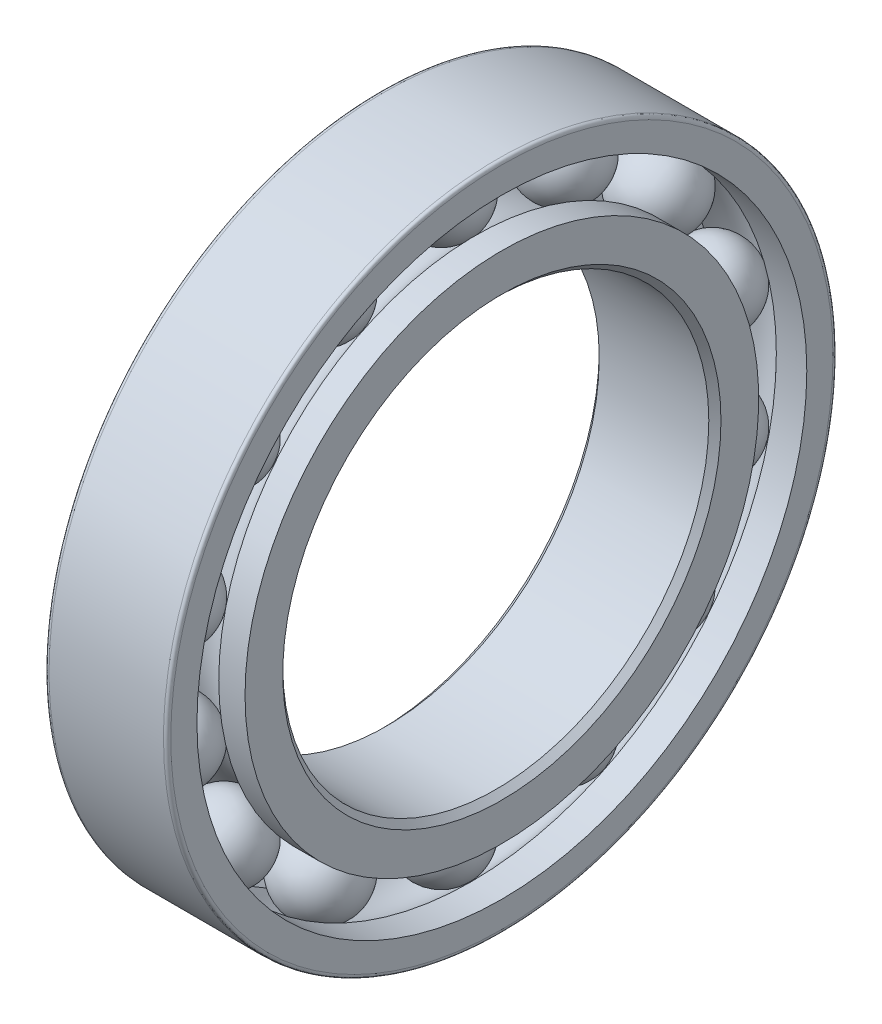
ISO-10303-21;
HEADER;
FILE_DESCRIPTION(('STEP AP214'),'2;1');
FILE_NAME('part.step','',(''),(''),'','','');
FILE_SCHEMA(('AUTOMOTIVE_DESIGN { 1 0 10303 214 1 1 1 1 }'));
ENDSEC;
DATA;
#1=APPLICATION_CONTEXT('core data for automotive mechanical design processes');
#2=APPLICATION_PROTOCOL_DEFINITION('international standard','automotive_design',2000,#1);
#3=PRODUCT_CONTEXT('',#1,'mechanical');
#4=PRODUCT('Part','Part','',(#3));
#5=PRODUCT_RELATED_PRODUCT_CATEGORY('part','',(#4));
#6=PRODUCT_DEFINITION_FORMATION('','',#4);
#7=PRODUCT_DEFINITION_CONTEXT('part definition',#1,'design');
#8=PRODUCT_DEFINITION('design','',#6,#7);
#9=PRODUCT_DEFINITION_SHAPE('','',#8);
#10=(LENGTH_UNIT() NAMED_UNIT(*) SI_UNIT(.MILLI.,.METRE.));
#11=(NAMED_UNIT(*) PLANE_ANGLE_UNIT() SI_UNIT($,.RADIAN.));
#12=(NAMED_UNIT(*) SI_UNIT($,.STERADIAN.) SOLID_ANGLE_UNIT());
#13=UNCERTAINTY_MEASURE_WITH_UNIT(LENGTH_MEASURE(1.E-05),#10,'distance_accuracy_value','');
#14=(GEOMETRIC_REPRESENTATION_CONTEXT(3) GLOBAL_UNCERTAINTY_ASSIGNED_CONTEXT((#13)) GLOBAL_UNIT_ASSIGNED_CONTEXT((#10,
#11,#12)) REPRESENTATION_CONTEXT('',''));
#15=CARTESIAN_POINT('',(0.,0.,0.));
#16=DIRECTION('',(0.,0.,1.));
#17=DIRECTION('',(1.,0.,0.));
#18=AXIS2_PLACEMENT_3D('',#15,#16,#17);
#19=CARTESIAN_POINT('',(0.,20.5781289428914,9.90990460144476));
#20=DIRECTION('',(-1.,0.,0.));
#21=DIRECTION('',(0.,0.900968867902425,0.433883739117546));
#22=AXIS2_PLACEMENT_3D('',#19,#20,#21);
#23=SPHERICAL_SURFACE('',#22,3.3);
#24=CARTESIAN_POINT('',(-3.3,20.5781289428914,9.90990460144476));
#25=VERTEX_POINT('',#24);
#26=VERTEX_LOOP('',#25);
#27=FACE_BOUND('',#26,.T.);
#28=ADVANCED_FACE('F40',(#27),#23,.T.);
#29=CLOSED_SHELL('',(#28));
#30=MANIFOLD_SOLID_BREP('B2',#29);
#31=CARTESIAN_POINT('',(0.,14.2405070744537,17.8570310595696));
#32=DIRECTION('',(-1.,0.,0.));
#33=DIRECTION('',(0.,0.623489801858743,0.781831482468022));
#34=AXIS2_PLACEMENT_3D('',#31,#32,#33);
#35=SPHERICAL_SURFACE('',#34,3.3);
#36=CARTESIAN_POINT('',(-3.3,14.2405070744537,17.8570310595696));
#37=VERTEX_POINT('',#36);
#38=VERTEX_LOOP('',#37);
#39=FACE_BOUND('',#38,.T.);
#40=ADVANCED_FACE('F59',(#39),#35,.T.);
#41=CLOSED_SHELL('',(#40));
#42=MANIFOLD_SOLID_BREP('B6',#41);
#43=CARTESIAN_POINT('',(0.,5.08237813156245,22.2673535142328));
#44=DIRECTION('',(-1.,0.,0.));
#45=DIRECTION('',(0.,0.222520933956325,0.974927912181821));
#46=AXIS2_PLACEMENT_3D('',#43,#44,#45);
#47=SPHERICAL_SURFACE('',#46,3.3);
#48=CARTESIAN_POINT('',(-3.3,5.08237813156245,22.2673535142328));
#49=VERTEX_POINT('',#48);
#50=VERTEX_LOOP('',#49);
#51=FACE_BOUND('',#50,.T.);
#52=ADVANCED_FACE('F78',(#51),#47,.T.);
#53=CLOSED_SHELL('',(#52));
#54=MANIFOLD_SOLID_BREP('B36',#53);
#55=CARTESIAN_POINT('',(0.,-5.08237813156201,22.2673535142329));
#56=DIRECTION('',(-1.,0.,0.));
#57=DIRECTION('',(0.,-0.222520933956305,0.974927912181826));
#58=AXIS2_PLACEMENT_3D('',#55,#56,#57);
#59=SPHERICAL_SURFACE('',#58,3.3);
#60=CARTESIAN_POINT('',(-3.3,-5.08237813156201,22.2673535142329));
#61=VERTEX_POINT('',#60);
#62=VERTEX_LOOP('',#61);
#63=FACE_BOUND('',#62,.T.);
#64=ADVANCED_FACE('F97',(#63),#59,.T.);
#65=CLOSED_SHELL('',(#64));
#66=MANIFOLD_SOLID_BREP('B55',#65);
#67=CARTESIAN_POINT('',(0.,-14.2405070744533,17.8570310595699));
#68=DIRECTION('',(-1.,0.,0.));
#69=DIRECTION('',(0.,-0.623489801858727,0.781831482468035));
#70=AXIS2_PLACEMENT_3D('',#67,#68,#69);
#71=SPHERICAL_SURFACE('',#70,3.3);
#72=CARTESIAN_POINT('',(-3.3,-14.2405070744533,17.8570310595699));
#73=VERTEX_POINT('',#72);
#74=VERTEX_LOOP('',#73);
#75=FACE_BOUND('',#74,.T.);
#76=ADVANCED_FACE('F116',(#75),#71,.T.);
#77=CLOSED_SHELL('',(#76));
#78=MANIFOLD_SOLID_BREP('B74',#77);
#79=CARTESIAN_POINT('',(0.,-20.5781289428912,9.90990460144519));
#80=DIRECTION('',(-1.,0.,0.));
#81=DIRECTION('',(0.,-0.900968867902416,0.433883739117565));
#82=AXIS2_PLACEMENT_3D('',#79,#80,#81);
#83=SPHERICAL_SURFACE('',#82,3.3);
#84=CARTESIAN_POINT('',(-3.3,-20.5781289428912,9.90990460144519));
#85=VERTEX_POINT('',#84);
#86=VERTEX_LOOP('',#85);
#87=FACE_BOUND('',#86,.T.);
#88=ADVANCED_FACE('F135',(#87),#83,.T.);
#89=CLOSED_SHELL('',(#88));
#90=MANIFOLD_SOLID_BREP('B93',#89);
#91=CARTESIAN_POINT('',(0.,-22.84,0.));
#92=DIRECTION('',(-1.,0.,0.));
#93=DIRECTION('',(0.,-1.,0.));
#94=AXIS2_PLACEMENT_3D('',#91,#92,#93);
#95=SPHERICAL_SURFACE('',#94,3.3);
#96=CARTESIAN_POINT('',(-3.3,-22.84,0.));
#97=VERTEX_POINT('',#96);
#98=VERTEX_LOOP('',#97);
#99=FACE_BOUND('',#98,.T.);
#100=ADVANCED_FACE('F154',(#99),#95,.T.);
#101=CLOSED_SHELL('',(#100));
#102=MANIFOLD_SOLID_BREP('B112',#101);
#103=CARTESIAN_POINT('',(0.,-20.5781289428913,-9.9099046014449));
#104=DIRECTION('',(-1.,0.,0.));
#105=DIRECTION('',(0.,-0.900968867902422,-0.433883739117553));
#106=AXIS2_PLACEMENT_3D('',#103,#104,#105);
#107=SPHERICAL_SURFACE('',#106,3.3);
#108=CARTESIAN_POINT('',(-3.3,-20.5781289428913,-9.9099046014449));
#109=VERTEX_POINT('',#108);
#110=VERTEX_LOOP('',#109);
#111=FACE_BOUND('',#110,.T.);
#112=ADVANCED_FACE('F173',(#111),#107,.T.);
#113=CLOSED_SHELL('',(#112));
#114=MANIFOLD_SOLID_BREP('B131',#113);
#115=CARTESIAN_POINT('',(0.,-14.2405070744536,-17.8570310595697));
#116=DIRECTION('',(-1.,0.,0.));
#117=DIRECTION('',(0.,-0.623489801858737,-0.781831482468027));
#118=AXIS2_PLACEMENT_3D('',#115,#116,#117);
#119=SPHERICAL_SURFACE('',#118,3.3);
#120=CARTESIAN_POINT('',(-3.3,-14.2405070744536,-17.8570310595697));
#121=VERTEX_POINT('',#120);
#122=VERTEX_LOOP('',#121);
#123=FACE_BOUND('',#122,.T.);
#124=ADVANCED_FACE('F192',(#123),#119,.T.);
#125=CLOSED_SHELL('',(#124));
#126=MANIFOLD_SOLID_BREP('B150',#125);
#127=CARTESIAN_POINT('',(0.,-5.08237813156231,-22.2673535142328));
#128=DIRECTION('',(-1.,0.,0.));
#129=DIRECTION('',(0.,-0.222520933956318,-0.974927912181823));
#130=AXIS2_PLACEMENT_3D('',#127,#128,#129);
#131=SPHERICAL_SURFACE('',#130,3.3);
#132=CARTESIAN_POINT('',(-3.3,-5.08237813156231,-22.2673535142328));
#133=VERTEX_POINT('',#132);
#134=VERTEX_LOOP('',#133);
#135=FACE_BOUND('',#134,.T.);
#136=ADVANCED_FACE('F211',(#135),#131,.T.);
#137=CLOSED_SHELL('',(#136));
#138=MANIFOLD_SOLID_BREP('B169',#137);
#139=CARTESIAN_POINT('',(0.,5.08237813156215,-22.2673535142329));
#140=DIRECTION('',(-1.,0.,0.));
#141=DIRECTION('',(0.,0.222520933956311,-0.974927912181824));
#142=AXIS2_PLACEMENT_3D('',#139,#140,#141);
#143=SPHERICAL_SURFACE('',#142,3.3);
#144=CARTESIAN_POINT('',(-3.3,5.08237813156215,-22.2673535142329));
#145=VERTEX_POINT('',#144);
#146=VERTEX_LOOP('',#145);
#147=FACE_BOUND('',#146,.T.);
#148=ADVANCED_FACE('F230',(#147),#143,.T.);
#149=CLOSED_SHELL('',(#148));
#150=MANIFOLD_SOLID_BREP('B188',#149);
#151=CARTESIAN_POINT('',(0.,14.2405070744534,-17.8570310595698));
#152=DIRECTION('',(-1.,0.,0.));
#153=DIRECTION('',(0.,0.623489801858732,-0.781831482468031));
#154=AXIS2_PLACEMENT_3D('',#151,#152,#153);
#155=SPHERICAL_SURFACE('',#154,3.3);
#156=CARTESIAN_POINT('',(-3.3,14.2405070744534,-17.8570310595698));
#157=VERTEX_POINT('',#156);
#158=VERTEX_LOOP('',#157);
#159=FACE_BOUND('',#158,.T.);
#160=ADVANCED_FACE('F249',(#159),#155,.T.);
#161=CLOSED_SHELL('',(#160));
#162=MANIFOLD_SOLID_BREP('B207',#161);
#163=CARTESIAN_POINT('',(0.,20.5781289428912,-9.90990460144505));
#164=DIRECTION('',(-1.,0.,0.));
#165=DIRECTION('',(0.,0.900968867902419,-0.433883739117559));
#166=AXIS2_PLACEMENT_3D('',#163,#164,#165);
#167=SPHERICAL_SURFACE('',#166,3.3);
#168=CARTESIAN_POINT('',(-3.3,20.5781289428912,-9.90990460144505));
#169=VERTEX_POINT('',#168);
#170=VERTEX_LOOP('',#169);
#171=FACE_BOUND('',#170,.T.);
#172=ADVANCED_FACE('F268',(#171),#167,.T.);
#173=CLOSED_SHELL('',(#172));
#174=MANIFOLD_SOLID_BREP('B226',#173);
#175=CARTESIAN_POINT('',(0.,22.84,0.));
#176=DIRECTION('',(-1.,0.,0.));
#177=DIRECTION('',(0.,1.,0.));
#178=AXIS2_PLACEMENT_3D('',#175,#176,#177);
#179=SPHERICAL_SURFACE('',#178,3.3);
#180=CARTESIAN_POINT('',(-3.3,22.84,0.));
#181=VERTEX_POINT('',#180);
#182=VERTEX_LOOP('',#181);
#183=FACE_BOUND('',#182,.T.);
#184=ADVANCED_FACE('F289',(#183),#179,.T.);
#185=CLOSED_SHELL('',(#184));
#186=MANIFOLD_SOLID_BREP('B245',#185);
#187=CARTESIAN_POINT('',(0.,0.,0.));
#188=DIRECTION('',(-1.,0.,0.));
#189=DIRECTION('',(0.,0.,1.));
#190=AXIS2_PLACEMENT_3D('',#187,#188,#189);
#191=TOROIDAL_SURFACE('',#190,22.8429213824207,3.33349012996014);
#192=CARTESIAN_POINT('',(-2.49819143028827,0.,0.));
#193=DIRECTION('',(-1.,0.,0.));
#194=DIRECTION('',(0.,0.,1.));
#195=AXIS2_PLACEMENT_3D('',#192,#193,#194);
#196=CIRCLE('',#195,25.05);
#197=CARTESIAN_POINT('',(-2.49819143028827,0.,25.05));
#198=VERTEX_POINT('',#197);
#199=EDGE_CURVE('E453',#198,#198,#196,.T.);
#200=ORIENTED_EDGE('',*,*,#199,.T.);
#201=EDGE_LOOP('',(#200));
#202=FACE_BOUND('',#201,.T.);
#203=CARTESIAN_POINT('',(2.49819143028827,0.,0.));
#204=DIRECTION('',(-1.,0.,0.));
#205=DIRECTION('',(0.,0.,1.));
#206=AXIS2_PLACEMENT_3D('',#203,#204,#205);
#207=CIRCLE('',#206,25.05);
#208=CARTESIAN_POINT('',(2.49819143028827,0.,25.05));
#209=VERTEX_POINT('',#208);
#210=EDGE_CURVE('E337',#209,#209,#207,.T.);
#211=ORIENTED_EDGE('',*,*,#210,.F.);
#212=EDGE_LOOP('',(#211));
#213=FACE_BOUND('',#212,.T.);
#214=ADVANCED_FACE('F309',(#202,#213),#191,.F.);
#215=CARTESIAN_POINT('',(-23.9937106918239,0.,0.));
#216=DIRECTION('',(-1.,0.,0.));
#217=DIRECTION('',(0.,0.,1.));
#218=AXIS2_PLACEMENT_3D('',#215,#216,#217);
#219=CYLINDRICAL_SURFACE('',#218,25.05);
#220=ORIENTED_EDGE('',*,*,#210,.T.);
#221=EDGE_LOOP('',(#220));
#222=FACE_BOUND('',#221,.T.);
#223=CARTESIAN_POINT('',(5.,0.,0.));
#224=DIRECTION('',(-1.,0.,0.));
#225=DIRECTION('',(0.,0.,1.));
#226=AXIS2_PLACEMENT_3D('',#223,#224,#225);
#227=CIRCLE('',#226,25.05);
#228=CARTESIAN_POINT('',(5.,0.,25.05));
#229=VERTEX_POINT('',#228);
#230=EDGE_CURVE('E342',#229,#229,#227,.T.);
#231=ORIENTED_EDGE('',*,*,#230,.F.);
#232=EDGE_LOOP('',(#231));
#233=FACE_BOUND('',#232,.T.);
#234=ADVANCED_FACE('F445',(#222,#233),#219,.F.);
#235=CARTESIAN_POINT('',(5.,0.,0.));
#236=DIRECTION('',(-1.,0.,0.));
#237=DIRECTION('',(0.,0.,1.));
#238=AXIS2_PLACEMENT_3D('',#235,#236,#237);
#239=PLANE('',#238);
#240=CARTESIAN_POINT('',(5.,0.,27.2));
#241=CARTESIAN_POINT('',(5.,3.55999255256262,27.2));
#242=CARTESIAN_POINT('',(5.,10.6799776576878,25.7837469070317));
#243=CARTESIAN_POINT('',(5.,19.7340255312313,19.7340255312313));
#244=CARTESIAN_POINT('',(5.,25.7837469070317,10.6799776576878));
#245=CARTESIAN_POINT('',(5.,27.9081265464842,0.));
#246=CARTESIAN_POINT('',(5.,25.7837469070317,-10.6799776576879));
#247=CARTESIAN_POINT('',(5.,19.7340255312312,-19.7340255312313));
#248=CARTESIAN_POINT('',(5.,10.6799776576879,-25.7837469070316));
#249=CARTESIAN_POINT('',(5.,0.,-27.9081265464842));
#250=CARTESIAN_POINT('',(5.,-10.6799776576878,-25.7837469070317));
#251=CARTESIAN_POINT('',(5.,-19.7340255312313,-19.7340255312312));
#252=CARTESIAN_POINT('',(5.,-25.7837469070316,-10.6799776576879));
#253=CARTESIAN_POINT('',(5.,-27.9081265464842,1.14051163587725E-13));
#254=CARTESIAN_POINT('',(5.,-25.7837469070317,10.6799776576878));
#255=CARTESIAN_POINT('',(5.,-19.7340255312314,19.7340255312312));
#256=CARTESIAN_POINT('',(5.,-10.6799776576879,25.7837469070317));
#257=CARTESIAN_POINT('',(5.,-3.55999255256262,27.2));
#258=CARTESIAN_POINT('',(5.,0.,27.2));
#259=B_SPLINE_CURVE_WITH_KNOTS('',3,(#240,#241,#242,#243,#244,#245,#246,#247,#248,#249,#250,
#251,#252,#253,#254,#255,#256,#257,#258),.UNSPECIFIED.,.T.,.F.,(4,1,1,1,1,1,1,1,1,1,1,1,1,1,1,1,
4),(0.,0.392699081698724,0.785398163397448,1.17809724509617,1.5707963267949,1.96349540849362,
2.35619449019234,2.74889357189107,3.14159265358979,3.53429173528852,3.92699081698724,
4.31968989868597,4.71238898038469,5.10508806208341,5.49778714378214,5.89048622548086,
6.28318530717959),.UNSPECIFIED.);
#260=CARTESIAN_POINT('',(5.,0.,27.2));
#261=VERTEX_POINT('',#260);
#262=EDGE_CURVE('E322',#261,#261,#259,.F.);
#263=ORIENTED_EDGE('',*,*,#262,.T.);
#264=EDGE_LOOP('',(#263));
#265=FACE_BOUND('',#264,.T.);
#266=ORIENTED_EDGE('',*,*,#230,.T.);
#267=EDGE_LOOP('',(#266));
#268=FACE_BOUND('',#267,.T.);
#269=ADVANCED_FACE('F366',(#265,#268),#239,.F.);
#270=CARTESIAN_POINT('',(-23.9937106918239,0.,0.));
#271=DIRECTION('',(-1.,0.,0.));
#272=DIRECTION('',(0.,0.,1.));
#273=AXIS2_PLACEMENT_3D('',#270,#271,#272);
#274=CYLINDRICAL_SURFACE('',#273,27.5);
#275=CARTESIAN_POINT('',(4.7,0.,27.5));
#276=CARTESIAN_POINT('',(4.7,-3.59925717630412,27.5));
#277=CARTESIAN_POINT('',(4.7,-10.7977715289124,26.0681264685062));
#278=CARTESIAN_POINT('',(4.7,-19.9516802245905,19.9516802245904));
#279=CARTESIAN_POINT('',(4.7,-26.0681264685063,10.7977715289123));
#280=CARTESIAN_POINT('',(4.7,-28.2159367657469,1.14907919370574E-13));
#281=CARTESIAN_POINT('',(4.7,-26.0681264685062,-10.7977715289124));
#282=CARTESIAN_POINT('',(4.7,-19.9516802245905,-19.9516802245904));
#283=CARTESIAN_POINT('',(4.7,-10.7977715289123,-26.0681264685063));
#284=CARTESIAN_POINT('',(4.7,0.,-28.2159367657469));
#285=CARTESIAN_POINT('',(4.7,10.7977715289124,-26.0681264685062));
#286=CARTESIAN_POINT('',(4.7,19.9516802245904,-19.9516802245905));
#287=CARTESIAN_POINT('',(4.7,26.0681264685063,-10.7977715289124));
#288=CARTESIAN_POINT('',(4.7,28.2159367657469,0.));
#289=CARTESIAN_POINT('',(4.7,26.0681264685063,10.7977715289123));
#290=CARTESIAN_POINT('',(4.7,19.9516802245904,19.9516802245904));
#291=CARTESIAN_POINT('',(4.7,10.7977715289123,26.0681264685063));
#292=CARTESIAN_POINT('',(4.7,3.59925717630412,27.5));
#293=CARTESIAN_POINT('',(4.7,0.,27.5));
#294=B_SPLINE_CURVE_WITH_KNOTS('',3,(#275,#276,#277,#278,#279,#280,#281,#282,#283,#284,#285,
#286,#287,#288,#289,#290,#291,#292,#293),.UNSPECIFIED.,.T.,.F.,(4,1,1,1,1,1,1,1,1,1,1,1,1,1,1,1,
4),(0.,0.392699081698724,0.785398163397448,1.17809724509617,1.5707963267949,1.96349540849362,
2.35619449019235,2.74889357189107,3.14159265358979,3.53429173528852,3.92699081698724,
4.31968989868597,4.71238898038469,5.10508806208341,5.49778714378214,5.89048622548086,
6.28318530717959),.UNSPECIFIED.);
#295=CARTESIAN_POINT('',(4.7,0.,27.5));
#296=VERTEX_POINT('',#295);
#297=EDGE_CURVE('E327',#296,#296,#294,.F.);
#298=ORIENTED_EDGE('',*,*,#297,.T.);
#299=EDGE_LOOP('',(#298));
#300=FACE_BOUND('',#299,.T.);
#301=CARTESIAN_POINT('',(-4.7,0.,27.5));
#302=CARTESIAN_POINT('',(-4.7,3.59925717630412,27.5));
#303=CARTESIAN_POINT('',(-4.7,10.7977715289123,26.0681264685063));
#304=CARTESIAN_POINT('',(-4.7,19.9516802245904,19.9516802245904));
#305=CARTESIAN_POINT('',(-4.7,26.0681264685063,10.7977715289123));
#306=CARTESIAN_POINT('',(-4.7,28.2159367657469,0.));
#307=CARTESIAN_POINT('',(-4.7,26.0681264685063,-10.7977715289124));
#308=CARTESIAN_POINT('',(-4.7,19.9516802245904,-19.9516802245905));
#309=CARTESIAN_POINT('',(-4.7,10.7977715289124,-26.0681264685062));
#310=CARTESIAN_POINT('',(-4.7,0.,-28.2159367657469));
#311=CARTESIAN_POINT('',(-4.7,-10.7977715289123,-26.0681264685063));
#312=CARTESIAN_POINT('',(-4.7,-19.9516802245905,-19.9516802245904));
#313=CARTESIAN_POINT('',(-4.7,-26.0681264685062,-10.7977715289124));
#314=CARTESIAN_POINT('',(-4.7,-28.2159367657469,1.14907919370574E-13));
#315=CARTESIAN_POINT('',(-4.7,-26.0681264685063,10.7977715289123));
#316=CARTESIAN_POINT('',(-4.7,-19.9516802245905,19.9516802245904));
#317=CARTESIAN_POINT('',(-4.7,-10.7977715289124,26.0681264685062));
#318=CARTESIAN_POINT('',(-4.7,-3.59925717630412,27.5));
#319=CARTESIAN_POINT('',(-4.7,0.,27.5));
#320=B_SPLINE_CURVE_WITH_KNOTS('',3,(#301,#302,#303,#304,#305,#306,#307,#308,#309,#310,#311,
#312,#313,#314,#315,#316,#317,#318,#319),.UNSPECIFIED.,.T.,.F.,(4,1,1,1,1,1,1,1,1,1,1,1,1,1,1,1,
4),(0.,0.392699081698724,0.785398163397448,1.17809724509617,1.5707963267949,1.96349540849362,
2.35619449019234,2.74889357189107,3.14159265358979,3.53429173528852,3.92699081698724,
4.31968989868597,4.71238898038469,5.10508806208341,5.49778714378214,5.89048622548086,
6.28318530717959),.UNSPECIFIED.);
#321=CARTESIAN_POINT('',(-4.7,0.,27.5));
#322=VERTEX_POINT('',#321);
#323=EDGE_CURVE('E332',#322,#322,#320,.F.);
#324=ORIENTED_EDGE('',*,*,#323,.T.);
#325=EDGE_LOOP('',(#324));
#326=FACE_BOUND('',#325,.T.);
#327=ADVANCED_FACE('F355',(#300,#326),#274,.T.);
#328=CARTESIAN_POINT('',(-5.,0.,0.));
#329=DIRECTION('',(-1.,0.,0.));
#330=DIRECTION('',(0.,0.,1.));
#331=AXIS2_PLACEMENT_3D('',#328,#329,#330);
#332=PLANE('',#331);
#333=CARTESIAN_POINT('',(-5.,0.,27.2));
#334=CARTESIAN_POINT('',(-5.,-3.55999255256262,27.2));
#335=CARTESIAN_POINT('',(-5.00000000000001,-10.6799776576879,25.7837469070316));
#336=CARTESIAN_POINT('',(-5.,-19.7340255312313,19.7340255312312));
#337=CARTESIAN_POINT('',(-5.,-25.7837469070316,10.6799776576878));
#338=CARTESIAN_POINT('',(-5.,-27.9081265464842,1.14051163587725E-13));
#339=CARTESIAN_POINT('',(-5.,-25.7837469070316,-10.6799776576879));
#340=CARTESIAN_POINT('',(-5.,-19.7340255312313,-19.7340255312312));
#341=CARTESIAN_POINT('',(-5.,-10.6799776576878,-25.7837469070317));
#342=CARTESIAN_POINT('',(-5.,0.,-27.9081265464842));
#343=CARTESIAN_POINT('',(-5.,10.6799776576879,-25.7837469070316));
#344=CARTESIAN_POINT('',(-5.,19.7340255312312,-19.7340255312313));
#345=CARTESIAN_POINT('',(-5.,25.7837469070317,-10.6799776576879));
#346=CARTESIAN_POINT('',(-5.,27.9081265464842,0.));
#347=CARTESIAN_POINT('',(-5.,25.7837469070316,10.6799776576878));
#348=CARTESIAN_POINT('',(-5.,19.7340255312313,19.7340255312313));
#349=CARTESIAN_POINT('',(-5.,10.6799776576878,25.7837469070316));
#350=CARTESIAN_POINT('',(-5.,3.55999255256262,27.2));
#351=CARTESIAN_POINT('',(-5.,0.,27.2));
#352=B_SPLINE_CURVE_WITH_KNOTS('',3,(#333,#334,#335,#336,#337,#338,#339,#340,#341,#342,#343,
#344,#345,#346,#347,#348,#349,#350,#351),.UNSPECIFIED.,.T.,.F.,(4,1,1,1,1,1,1,1,1,1,1,1,1,1,1,1,
4),(0.,0.392699081698724,0.785398163397448,1.17809724509617,1.5707963267949,1.96349540849362,
2.35619449019235,2.74889357189107,3.14159265358979,3.53429173528852,3.92699081698724,
4.31968989868597,4.71238898038469,5.10508806208341,5.49778714378214,5.89048622548086,
6.28318530717959),.UNSPECIFIED.);
#353=CARTESIAN_POINT('',(-5.,0.,27.2));
#354=VERTEX_POINT('',#353);
#355=EDGE_CURVE('E288',#354,#354,#352,.F.);
#356=ORIENTED_EDGE('',*,*,#355,.T.);
#357=EDGE_LOOP('',(#356));
#358=FACE_BOUND('',#357,.T.);
#359=CARTESIAN_POINT('',(-5.,0.,0.));
#360=DIRECTION('',(-1.,0.,0.));
#361=DIRECTION('',(0.,0.,1.));
#362=AXIS2_PLACEMENT_3D('',#359,#360,#361);
#363=CIRCLE('',#362,25.05);
#364=CARTESIAN_POINT('',(-5.,0.,25.05));
#365=VERTEX_POINT('',#364);
#366=EDGE_CURVE('E347',#365,#365,#363,.T.);
#367=ORIENTED_EDGE('',*,*,#366,.F.);
#368=EDGE_LOOP('',(#367));
#369=FACE_BOUND('',#368,.T.);
#370=ADVANCED_FACE('F365',(#358,#369),#332,.T.);
#371=ORIENTED_EDGE('',*,*,#366,.T.);
#372=EDGE_LOOP('',(#371));
#373=FACE_BOUND('',#372,.T.);
#374=ORIENTED_EDGE('',*,*,#199,.F.);
#375=EDGE_LOOP('',(#374));
#376=FACE_BOUND('',#375,.T.);
#377=ADVANCED_FACE('F415',(#373,#376),#219,.F.);
#378=CARTESIAN_POINT('',(4.7,0.,27.5));
#379=CARTESIAN_POINT('',(4.7,3.59925717630412,27.5));
#380=CARTESIAN_POINT('',(4.7,10.7977715289123,26.0681264685063));
#381=CARTESIAN_POINT('',(4.7,19.9516802245904,19.9516802245904));
#382=CARTESIAN_POINT('',(4.7,26.0681264685063,10.7977715289123));
#383=CARTESIAN_POINT('',(4.7,28.2159367657469,0.));
#384=CARTESIAN_POINT('',(4.7,26.0681264685063,-10.7977715289124));
#385=CARTESIAN_POINT('',(4.7,19.9516802245904,-19.9516802245905));
#386=CARTESIAN_POINT('',(4.7,10.7977715289124,-26.0681264685062));
#387=CARTESIAN_POINT('',(4.7,0.,-28.2159367657469));
#388=CARTESIAN_POINT('',(4.7,-10.7977715289123,-26.0681264685063));
#389=CARTESIAN_POINT('',(4.7,-19.9516802245905,-19.9516802245904));
#390=CARTESIAN_POINT('',(4.7,-26.0681264685062,-10.7977715289124));
#391=CARTESIAN_POINT('',(4.7,-28.2159367657469,1.14907919370574E-13));
#392=CARTESIAN_POINT('',(4.7,-26.0681264685063,10.7977715289123));
#393=CARTESIAN_POINT('',(4.7,-19.9516802245905,19.9516802245904));
#394=CARTESIAN_POINT('',(4.7,-10.7977715289124,26.0681264685062));
#395=CARTESIAN_POINT('',(4.7,-3.59925717630412,27.5));
#396=CARTESIAN_POINT('',(4.7,0.,27.5));
#397=CARTESIAN_POINT('',(4.75045941546018,0.,27.5));
#398=CARTESIAN_POINT('',(4.75045941546018,3.59925717630412,27.5));
#399=CARTESIAN_POINT('',(4.75045941546018,10.7977715289123,26.0681264685063));
#400=CARTESIAN_POINT('',(4.75045941546018,19.9516802245904,19.9516802245904));
#401=CARTESIAN_POINT('',(4.75045941546018,26.0681264685063,10.7977715289123));
#402=CARTESIAN_POINT('',(4.75045941546018,28.2159367657469,0.));
#403=CARTESIAN_POINT('',(4.75045941546018,26.0681264685063,-10.7977715289124));
#404=CARTESIAN_POINT('',(4.75045941546018,19.9516802245904,-19.9516802245905));
#405=CARTESIAN_POINT('',(4.75045941546019,10.7977715289124,-26.0681264685062));
#406=CARTESIAN_POINT('',(4.75045941546018,0.,-28.2159367657469));
#407=CARTESIAN_POINT('',(4.75045941546018,-10.7977715289123,-26.0681264685063));
#408=CARTESIAN_POINT('',(4.75045941546018,-19.9516802245905,-19.9516802245904));
#409=CARTESIAN_POINT('',(4.75045941546019,-26.0681264685062,-10.7977715289124));
#410=CARTESIAN_POINT('',(4.75045941546018,-28.2159367657469,1.14907919370574E-13));
#411=CARTESIAN_POINT('',(4.75045941546018,-26.0681264685063,10.7977715289123));
#412=CARTESIAN_POINT('',(4.75045941546019,-19.9516802245905,19.9516802245904));
#413=CARTESIAN_POINT('',(4.75045941546018,-10.7977715289124,26.0681264685062));
#414=CARTESIAN_POINT('',(4.75045941546018,-3.59925717630412,27.5));
#415=CARTESIAN_POINT('',(4.75045941546018,0.,27.5));
#416=CARTESIAN_POINT('',(4.80091883092037,0.,27.5));
#417=CARTESIAN_POINT('',(4.80091883092037,3.59925717630412,27.5));
#418=CARTESIAN_POINT('',(4.80091883092037,10.7977715289123,26.0681264685063));
#419=CARTESIAN_POINT('',(4.80091883092037,19.9516802245904,19.9516802245904));
#420=CARTESIAN_POINT('',(4.80091883092036,26.0681264685063,10.7977715289123));
#421=CARTESIAN_POINT('',(4.80091883092037,28.2159367657469,0.));
#422=CARTESIAN_POINT('',(4.80091883092037,26.0681264685063,-10.7977715289124));
#423=CARTESIAN_POINT('',(4.80091883092036,19.9516802245904,-19.9516802245905));
#424=CARTESIAN_POINT('',(4.80091883092037,10.7977715289124,-26.0681264685062));
#425=CARTESIAN_POINT('',(4.80091883092037,0.,-28.2159367657469));
#426=CARTESIAN_POINT('',(4.80091883092037,-10.7977715289123,-26.0681264685063));
#427=CARTESIAN_POINT('',(4.80091883092036,-19.9516802245905,-19.9516802245904));
#428=CARTESIAN_POINT('',(4.80091883092037,-26.0681264685062,-10.7977715289124));
#429=CARTESIAN_POINT('',(4.80091883092037,-28.2159367657469,1.14907919370574E-13));
#430=CARTESIAN_POINT('',(4.80091883092037,-26.0681264685063,10.7977715289123));
#431=CARTESIAN_POINT('',(4.80091883092037,-19.9516802245905,19.9516802245904));
#432=CARTESIAN_POINT('',(4.80091883092037,-10.7977715289124,26.0681264685062));
#433=CARTESIAN_POINT('',(4.80091883092037,-3.59925717630412,27.5));
#434=CARTESIAN_POINT('',(4.80091883092037,0.,27.5));
#435=CARTESIAN_POINT('',(4.91213203435596,0.,27.4784924240492));
#436=CARTESIAN_POINT('',(4.91213203435596,3.59644222004645,27.4784924240492));
#437=CARTESIAN_POINT('',(4.91213203435597,10.7893266601393,26.047738751782));
#438=CARTESIAN_POINT('',(4.91213203435597,19.9360761417622,19.9360761417622));
#439=CARTESIAN_POINT('',(4.91213203435596,26.047738751782,10.7893266601393));
#440=CARTESIAN_POINT('',(4.91213203435596,28.1938692601828,0.));
#441=CARTESIAN_POINT('',(4.91213203435597,26.047738751782,-10.7893266601393));
#442=CARTESIAN_POINT('',(4.91213203435597,19.9360761417621,-19.9360761417622));
#443=CARTESIAN_POINT('',(4.91213203435596,10.7893266601394,-26.047738751782));
#444=CARTESIAN_POINT('',(4.91213203435596,0.,-28.1938692601828));
#445=CARTESIAN_POINT('',(4.91213203435597,-10.7893266601393,-26.047738751782));
#446=CARTESIAN_POINT('',(4.91213203435597,-19.9360761417622,-19.9360761417621));
#447=CARTESIAN_POINT('',(4.91213203435596,-26.047738751782,-10.7893266601394));
#448=CARTESIAN_POINT('',(4.91213203435596,-28.1938692601828,1.16419604440461E-13));
#449=CARTESIAN_POINT('',(4.91213203435597,-26.047738751782,10.7893266601392));
#450=CARTESIAN_POINT('',(4.91213203435597,-19.9360761417623,19.9360761417621));
#451=CARTESIAN_POINT('',(4.91213203435597,-10.7893266601394,26.047738751782));
#452=CARTESIAN_POINT('',(4.91213203435596,-3.59644222004645,27.4784924240492));
#453=CARTESIAN_POINT('',(4.91213203435596,0.,27.4784924240492));
#454=CARTESIAN_POINT('',(4.97849242404918,0.,27.412132034356));
#455=CARTESIAN_POINT('',(4.97849242404918,3.58775683427097,27.412132034356));
#456=CARTESIAN_POINT('',(4.97849242404918,10.7632705028129,25.9848336233812));
#457=CARTESIAN_POINT('',(4.97849242404917,19.8879306408626,19.8879306408626));
#458=CARTESIAN_POINT('',(4.97849242404918,25.9848336233812,10.7632705028129));
#459=CARTESIAN_POINT('',(4.97849242404918,28.1257812398434,0.));
#460=CARTESIAN_POINT('',(4.97849242404917,25.9848336233812,-10.7632705028129));
#461=CARTESIAN_POINT('',(4.97849242404917,19.8879306408626,-19.8879306408626));
#462=CARTESIAN_POINT('',(4.97849242404918,10.763270502813,-25.9848336233812));
#463=CARTESIAN_POINT('',(4.97849242404917,0.,-28.1257812398433));
#464=CARTESIAN_POINT('',(4.97849242404918,-10.7632705028128,-25.9848336233812));
#465=CARTESIAN_POINT('',(4.97849242404917,-19.8879306408627,-19.8879306408626));
#466=CARTESIAN_POINT('',(4.97849242404917,-25.9848336233812,-10.763270502813));
#467=CARTESIAN_POINT('',(4.97849242404918,-28.1257812398434,1.12289301180741E-13));
#468=CARTESIAN_POINT('',(4.97849242404918,-25.9848336233812,10.7632705028128));
#469=CARTESIAN_POINT('',(4.97849242404917,-19.8879306408627,19.8879306408626));
#470=CARTESIAN_POINT('',(4.97849242404917,-10.7632705028129,25.9848336233812));
#471=CARTESIAN_POINT('',(4.97849242404918,-3.58775683427097,27.412132034356));
#472=CARTESIAN_POINT('',(4.97849242404918,0.,27.412132034356));
#473=CARTESIAN_POINT('',(5.,0.,27.3009188309204));
#474=CARTESIAN_POINT('',(5.,3.57320101897769,27.3009188309204));
#475=CARTESIAN_POINT('',(5.,10.719603056933,25.8794110833039));
#476=CARTESIAN_POINT('',(5.,19.8072437218917,19.8072437218917));
#477=CARTESIAN_POINT('',(5.,25.8794110833039,10.719603056933));
#478=CARTESIAN_POINT('',(5.,28.0116727047286,0.));
#479=CARTESIAN_POINT('',(5.,25.8794110833039,-10.719603056933));
#480=CARTESIAN_POINT('',(5.,19.8072437218917,-19.8072437218918));
#481=CARTESIAN_POINT('',(5.,10.7196030569331,-25.8794110833038));
#482=CARTESIAN_POINT('',(5.,0.,-28.0116727047286));
#483=CARTESIAN_POINT('',(5.,-10.719603056933,-25.8794110833039));
#484=CARTESIAN_POINT('',(5.,-19.8072437218918,-19.8072437218917));
#485=CARTESIAN_POINT('',(5.,-25.8794110833038,-10.7196030569331));
#486=CARTESIAN_POINT('',(5.,-28.0116727047286,1.16810157037741E-13));
#487=CARTESIAN_POINT('',(5.,-25.8794110833039,10.719603056933));
#488=CARTESIAN_POINT('',(5.,-19.8072437218918,19.8072437218917));
#489=CARTESIAN_POINT('',(5.,-10.7196030569331,25.8794110833038));
#490=CARTESIAN_POINT('',(5.,-3.57320101897769,27.3009188309204));
#491=CARTESIAN_POINT('',(5.,0.,27.3009188309204));
#492=CARTESIAN_POINT('',(5.,0.,27.2504594154602));
#493=CARTESIAN_POINT('',(5.,3.56659678577015,27.2504594154602));
#494=CARTESIAN_POINT('',(5.,10.6997903573104,25.8315789951677));
#495=CARTESIAN_POINT('',(5.,19.7706346265615,19.7706346265615));
#496=CARTESIAN_POINT('',(5.,25.8315789951677,10.6997903573104));
#497=CARTESIAN_POINT('',(5.,27.9598996256064,0.));
#498=CARTESIAN_POINT('',(5.,25.8315789951678,-10.6997903573104));
#499=CARTESIAN_POINT('',(5.,19.7706346265615,-19.7706346265615));
#500=CARTESIAN_POINT('',(5.,10.6997903573105,-25.8315789951677));
#501=CARTESIAN_POINT('',(5.,0.,-27.9598996256064));
#502=CARTESIAN_POINT('',(5.,-10.6997903573104,-25.8315789951678));
#503=CARTESIAN_POINT('',(5.,-19.7706346265616,-19.7706346265614));
#504=CARTESIAN_POINT('',(5.,-25.8315789951677,-10.6997903573105));
#505=CARTESIAN_POINT('',(5.,-27.9598996256064,1.1438481986646E-13));
#506=CARTESIAN_POINT('',(5.,-25.8315789951678,10.6997903573104));
#507=CARTESIAN_POINT('',(5.,-19.7706346265616,19.7706346265614));
#508=CARTESIAN_POINT('',(5.,-10.6997903573105,25.8315789951678));
#509=CARTESIAN_POINT('',(5.,-3.56659678577015,27.2504594154602));
#510=CARTESIAN_POINT('',(5.,0.,27.2504594154602));
#511=CARTESIAN_POINT('',(5.,0.,27.2));
#512=CARTESIAN_POINT('',(5.,3.55999255256262,27.2));
#513=CARTESIAN_POINT('',(5.,10.6799776576878,25.7837469070316));
#514=CARTESIAN_POINT('',(5.,19.7340255312313,19.7340255312313));
#515=CARTESIAN_POINT('',(5.,25.7837469070316,10.6799776576878));
#516=CARTESIAN_POINT('',(5.,27.9081265464842,0.));
#517=CARTESIAN_POINT('',(5.,25.7837469070317,-10.6799776576879));
#518=CARTESIAN_POINT('',(5.,19.7340255312312,-19.7340255312313));
#519=CARTESIAN_POINT('',(5.,10.6799776576879,-25.7837469070316));
#520=CARTESIAN_POINT('',(5.,0.,-27.9081265464842));
#521=CARTESIAN_POINT('',(5.,-10.6799776576878,-25.7837469070317));
#522=CARTESIAN_POINT('',(5.,-19.7340255312313,-19.7340255312312));
#523=CARTESIAN_POINT('',(5.,-25.7837469070316,-10.6799776576879));
#524=CARTESIAN_POINT('',(5.,-27.9081265464842,1.14051163587725E-13));
#525=CARTESIAN_POINT('',(5.,-25.7837469070316,10.6799776576878));
#526=CARTESIAN_POINT('',(5.,-19.7340255312313,19.7340255312312));
#527=CARTESIAN_POINT('',(5.,-10.6799776576879,25.7837469070316));
#528=CARTESIAN_POINT('',(5.,-3.55999255256262,27.2));
#529=CARTESIAN_POINT('',(5.,0.,27.2));
#530=B_SPLINE_SURFACE_WITH_KNOTS('',5,3,((#378,#379,#380,#381,#382,#383,#384,#385,#386,#387,
#388,#389,#390,#391,#392,#393,#394,#395,#396),(#397,#398,#399,#400,#401,#402,#403,#404,#405,
#406,#407,#408,#409,#410,#411,#412,#413,#414,#415),(#416,#417,#418,#419,#420,#421,#422,#423,
#424,#425,#426,#427,#428,#429,#430,#431,#432,#433,#434),(#435,#436,#437,#438,#439,#440,#441,
#442,#443,#444,#445,#446,#447,#448,#449,#450,#451,#452,#453),(#454,#455,#456,#457,#458,#459,
#460,#461,#462,#463,#464,#465,#466,#467,#468,#469,#470,#471,#472),(#473,#474,#475,#476,#477,
#478,#479,#480,#481,#482,#483,#484,#485,#486,#487,#488,#489,#490,#491),(#492,#493,#494,#495,
#496,#497,#498,#499,#500,#501,#502,#503,#504,#505,#506,#507,#508,#509,#510),(#511,#512,#513,
#514,#515,#516,#517,#518,#519,#520,#521,#522,#523,#524,#525,#526,#527,#528,#529)),.UNSPECIFIED.,
.F.,.T.,.F.,(6,2,6),(4,1,1,1,1,1,1,1,1,1,1,1,1,1,1,1,4),(0.,0.5,1.),(0.,0.392699081698724,
0.785398163397448,1.17809724509617,1.5707963267949,1.96349540849362,2.35619449019234,
2.74889357189107,3.14159265358979,3.53429173528852,3.92699081698724,4.31968989868597,
4.71238898038469,5.10508806208341,5.49778714378214,5.89048622548086,6.28318530717959),.UNSPECIFIED.);
#531=ORIENTED_EDGE('',*,*,#262,.F.);
#532=EDGE_LOOP('',(#531));
#533=FACE_BOUND('',#532,.T.);
#534=ORIENTED_EDGE('',*,*,#297,.F.);
#535=EDGE_LOOP('',(#534));
#536=FACE_BOUND('',#535,.T.);
#537=ADVANCED_FACE('F403',(#533,#536),#530,.T.);
#538=CARTESIAN_POINT('',(-5.,0.,27.2));
#539=CARTESIAN_POINT('',(-5.,3.55999255256262,27.2));
#540=CARTESIAN_POINT('',(-5.,10.6799776576878,25.7837469070316));
#541=CARTESIAN_POINT('',(-5.,19.7340255312313,19.7340255312313));
#542=CARTESIAN_POINT('',(-5.,25.7837469070316,10.6799776576878));
#543=CARTESIAN_POINT('',(-5.,27.9081265464842,0.));
#544=CARTESIAN_POINT('',(-5.,25.7837469070317,-10.6799776576879));
#545=CARTESIAN_POINT('',(-5.,19.7340255312312,-19.7340255312313));
#546=CARTESIAN_POINT('',(-5.,10.6799776576879,-25.7837469070316));
#547=CARTESIAN_POINT('',(-5.,0.,-27.9081265464842));
#548=CARTESIAN_POINT('',(-5.,-10.6799776576878,-25.7837469070317));
#549=CARTESIAN_POINT('',(-5.,-19.7340255312313,-19.7340255312312));
#550=CARTESIAN_POINT('',(-5.,-25.7837469070316,-10.6799776576879));
#551=CARTESIAN_POINT('',(-5.,-27.9081265464842,1.14051163587725E-13));
#552=CARTESIAN_POINT('',(-5.,-25.7837469070316,10.6799776576878));
#553=CARTESIAN_POINT('',(-5.,-19.7340255312313,19.7340255312312));
#554=CARTESIAN_POINT('',(-5.00000000000001,-10.6799776576879,25.7837469070316));
#555=CARTESIAN_POINT('',(-5.,-3.55999255256262,27.2));
#556=CARTESIAN_POINT('',(-5.,0.,27.2));
#557=CARTESIAN_POINT('',(-5.,0.,27.2504594154602));
#558=CARTESIAN_POINT('',(-5.,3.56659678577015,27.2504594154602));
#559=CARTESIAN_POINT('',(-5.,10.6997903573104,25.8315789951677));
#560=CARTESIAN_POINT('',(-5.,19.7706346265615,19.7706346265615));
#561=CARTESIAN_POINT('',(-5.,25.8315789951677,10.6997903573104));
#562=CARTESIAN_POINT('',(-5.,27.9598996256064,0.));
#563=CARTESIAN_POINT('',(-5.,25.8315789951678,-10.6997903573104));
#564=CARTESIAN_POINT('',(-5.,19.7706346265615,-19.7706346265615));
#565=CARTESIAN_POINT('',(-5.,10.6997903573105,-25.8315789951677));
#566=CARTESIAN_POINT('',(-5.,0.,-27.9598996256064));
#567=CARTESIAN_POINT('',(-5.,-10.6997903573104,-25.8315789951678));
#568=CARTESIAN_POINT('',(-5.,-19.7706346265616,-19.7706346265614));
#569=CARTESIAN_POINT('',(-5.,-25.8315789951677,-10.6997903573105));
#570=CARTESIAN_POINT('',(-5.,-27.9598996256064,1.1438481986646E-13));
#571=CARTESIAN_POINT('',(-5.,-25.8315789951678,10.6997903573104));
#572=CARTESIAN_POINT('',(-5.,-19.7706346265616,19.7706346265614));
#573=CARTESIAN_POINT('',(-5.00000000000001,-10.6997903573105,25.8315789951678));
#574=CARTESIAN_POINT('',(-5.,-3.56659678577015,27.2504594154602));
#575=CARTESIAN_POINT('',(-5.,0.,27.2504594154602));
#576=CARTESIAN_POINT('',(-5.,0.,27.3009188309204));
#577=CARTESIAN_POINT('',(-5.,3.57320101897769,27.3009188309204));
#578=CARTESIAN_POINT('',(-5.,10.719603056933,25.8794110833039));
#579=CARTESIAN_POINT('',(-5.,19.8072437218917,19.8072437218917));
#580=CARTESIAN_POINT('',(-5.,25.8794110833039,10.719603056933));
#581=CARTESIAN_POINT('',(-5.,28.0116727047286,0.));
#582=CARTESIAN_POINT('',(-5.,25.8794110833039,-10.719603056933));
#583=CARTESIAN_POINT('',(-5.,19.8072437218917,-19.8072437218918));
#584=CARTESIAN_POINT('',(-5.,10.7196030569331,-25.8794110833038));
#585=CARTESIAN_POINT('',(-5.,0.,-28.0116727047286));
#586=CARTESIAN_POINT('',(-5.,-10.719603056933,-25.8794110833039));
#587=CARTESIAN_POINT('',(-5.,-19.8072437218918,-19.8072437218917));
#588=CARTESIAN_POINT('',(-5.,-25.8794110833038,-10.7196030569331));
#589=CARTESIAN_POINT('',(-5.,-28.0116727047286,1.16810157037741E-13));
#590=CARTESIAN_POINT('',(-5.,-25.8794110833039,10.719603056933));
#591=CARTESIAN_POINT('',(-5.,-19.8072437218918,19.8072437218917));
#592=CARTESIAN_POINT('',(-5.00000000000001,-10.7196030569331,25.8794110833038));
#593=CARTESIAN_POINT('',(-5.,-3.57320101897769,27.3009188309204));
#594=CARTESIAN_POINT('',(-5.,0.,27.3009188309204));
#595=CARTESIAN_POINT('',(-4.97849242404918,0.,27.412132034356));
#596=CARTESIAN_POINT('',(-4.97849242404918,3.58775683427097,27.412132034356));
#597=CARTESIAN_POINT('',(-4.97849242404918,10.7632705028129,25.9848336233812));
#598=CARTESIAN_POINT('',(-4.97849242404917,19.8879306408626,19.8879306408626));
#599=CARTESIAN_POINT('',(-4.97849242404918,25.9848336233812,10.7632705028129));
#600=CARTESIAN_POINT('',(-4.97849242404918,28.1257812398434,0.));
#601=CARTESIAN_POINT('',(-4.97849242404918,25.9848336233812,-10.7632705028129));
#602=CARTESIAN_POINT('',(-4.97849242404917,19.8879306408626,-19.8879306408626));
#603=CARTESIAN_POINT('',(-4.97849242404918,10.763270502813,-25.9848336233812));
#604=CARTESIAN_POINT('',(-4.97849242404918,0.,-28.1257812398433));
#605=CARTESIAN_POINT('',(-4.97849242404918,-10.7632705028128,-25.9848336233812));
#606=CARTESIAN_POINT('',(-4.97849242404918,-19.8879306408627,-19.8879306408626));
#607=CARTESIAN_POINT('',(-4.97849242404918,-25.9848336233812,-10.763270502813));
#608=CARTESIAN_POINT('',(-4.97849242404918,-28.1257812398434,1.12289301180741E-13));
#609=CARTESIAN_POINT('',(-4.97849242404918,-25.9848336233812,10.7632705028128));
#610=CARTESIAN_POINT('',(-4.97849242404918,-19.8879306408627,19.8879306408626));
#611=CARTESIAN_POINT('',(-4.97849242404918,-10.7632705028129,25.9848336233812));
#612=CARTESIAN_POINT('',(-4.97849242404918,-3.58775683427097,27.412132034356));
#613=CARTESIAN_POINT('',(-4.97849242404918,0.,27.412132034356));
#614=CARTESIAN_POINT('',(-4.91213203435597,0.,27.4784924240492));
#615=CARTESIAN_POINT('',(-4.91213203435597,3.59644222004645,27.4784924240492));
#616=CARTESIAN_POINT('',(-4.91213203435597,10.7893266601393,26.047738751782));
#617=CARTESIAN_POINT('',(-4.91213203435597,19.9360761417622,19.9360761417622));
#618=CARTESIAN_POINT('',(-4.91213203435596,26.047738751782,10.7893266601393));
#619=CARTESIAN_POINT('',(-4.91213203435597,28.1938692601828,0.));
#620=CARTESIAN_POINT('',(-4.91213203435597,26.047738751782,-10.7893266601393));
#621=CARTESIAN_POINT('',(-4.91213203435597,19.9360761417621,-19.9360761417622));
#622=CARTESIAN_POINT('',(-4.91213203435597,10.7893266601394,-26.047738751782));
#623=CARTESIAN_POINT('',(-4.91213203435596,0.,-28.1938692601828));
#624=CARTESIAN_POINT('',(-4.91213203435597,-10.7893266601393,-26.047738751782));
#625=CARTESIAN_POINT('',(-4.91213203435597,-19.9360761417622,-19.9360761417621));
#626=CARTESIAN_POINT('',(-4.91213203435597,-26.047738751782,-10.7893266601394));
#627=CARTESIAN_POINT('',(-4.91213203435597,-28.1938692601828,1.16419604440461E-13));
#628=CARTESIAN_POINT('',(-4.91213203435597,-26.047738751782,10.7893266601392));
#629=CARTESIAN_POINT('',(-4.91213203435597,-19.9360761417623,19.9360761417621));
#630=CARTESIAN_POINT('',(-4.91213203435597,-10.7893266601394,26.047738751782));
#631=CARTESIAN_POINT('',(-4.91213203435597,-3.59644222004645,27.4784924240492));
#632=CARTESIAN_POINT('',(-4.91213203435597,0.,27.4784924240492));
#633=CARTESIAN_POINT('',(-4.80091883092037,0.,27.5));
#634=CARTESIAN_POINT('',(-4.80091883092037,3.59925717630412,27.5));
#635=CARTESIAN_POINT('',(-4.80091883092037,10.7977715289123,26.0681264685063));
#636=CARTESIAN_POINT('',(-4.80091883092037,19.9516802245904,19.9516802245904));
#637=CARTESIAN_POINT('',(-4.80091883092037,26.0681264685063,10.7977715289123));
#638=CARTESIAN_POINT('',(-4.80091883092037,28.2159367657469,0.));
#639=CARTESIAN_POINT('',(-4.80091883092037,26.0681264685063,-10.7977715289124));
#640=CARTESIAN_POINT('',(-4.80091883092037,19.9516802245904,-19.9516802245905));
#641=CARTESIAN_POINT('',(-4.80091883092038,10.7977715289124,-26.0681264685062));
#642=CARTESIAN_POINT('',(-4.80091883092037,0.,-28.2159367657469));
#643=CARTESIAN_POINT('',(-4.80091883092037,-10.7977715289123,-26.0681264685063));
#644=CARTESIAN_POINT('',(-4.80091883092037,-19.9516802245905,-19.9516802245904));
#645=CARTESIAN_POINT('',(-4.80091883092037,-26.0681264685062,-10.7977715289124));
#646=CARTESIAN_POINT('',(-4.80091883092037,-28.2159367657469,1.14907919370574E-13));
#647=CARTESIAN_POINT('',(-4.80091883092037,-26.0681264685063,10.7977715289123));
#648=CARTESIAN_POINT('',(-4.80091883092037,-19.9516802245905,19.9516802245904));
#649=CARTESIAN_POINT('',(-4.80091883092038,-10.7977715289124,26.0681264685062));
#650=CARTESIAN_POINT('',(-4.80091883092037,-3.59925717630412,27.5));
#651=CARTESIAN_POINT('',(-4.80091883092037,0.,27.5));
#652=CARTESIAN_POINT('',(-4.75045941546019,0.,27.5));
#653=CARTESIAN_POINT('',(-4.75045941546019,3.59925717630412,27.5));
#654=CARTESIAN_POINT('',(-4.75045941546019,10.7977715289123,26.0681264685063));
#655=CARTESIAN_POINT('',(-4.75045941546019,19.9516802245904,19.9516802245904));
#656=CARTESIAN_POINT('',(-4.75045941546019,26.0681264685063,10.7977715289123));
#657=CARTESIAN_POINT('',(-4.75045941546019,28.2159367657469,0.));
#658=CARTESIAN_POINT('',(-4.75045941546019,26.0681264685063,-10.7977715289124));
#659=CARTESIAN_POINT('',(-4.75045941546018,19.9516802245904,-19.9516802245905));
#660=CARTESIAN_POINT('',(-4.75045941546019,10.7977715289124,-26.0681264685062));
#661=CARTESIAN_POINT('',(-4.75045941546019,0.,-28.2159367657469));
#662=CARTESIAN_POINT('',(-4.75045941546019,-10.7977715289123,-26.0681264685063));
#663=CARTESIAN_POINT('',(-4.75045941546019,-19.9516802245905,-19.9516802245904));
#664=CARTESIAN_POINT('',(-4.75045941546019,-26.0681264685062,-10.7977715289124));
#665=CARTESIAN_POINT('',(-4.75045941546019,-28.2159367657469,1.14907919370574E-13));
#666=CARTESIAN_POINT('',(-4.75045941546019,-26.0681264685063,10.7977715289123));
#667=CARTESIAN_POINT('',(-4.75045941546019,-19.9516802245905,19.9516802245904));
#668=CARTESIAN_POINT('',(-4.75045941546019,-10.7977715289124,26.0681264685062));
#669=CARTESIAN_POINT('',(-4.75045941546019,-3.59925717630412,27.5));
#670=CARTESIAN_POINT('',(-4.75045941546019,0.,27.5));
#671=CARTESIAN_POINT('',(-4.7,0.,27.5));
#672=CARTESIAN_POINT('',(-4.7,3.59925717630412,27.5));
#673=CARTESIAN_POINT('',(-4.7,10.7977715289123,26.0681264685063));
#674=CARTESIAN_POINT('',(-4.7,19.9516802245904,19.9516802245904));
#675=CARTESIAN_POINT('',(-4.7,26.0681264685063,10.7977715289123));
#676=CARTESIAN_POINT('',(-4.7,28.2159367657469,0.));
#677=CARTESIAN_POINT('',(-4.7,26.0681264685063,-10.7977715289124));
#678=CARTESIAN_POINT('',(-4.7,19.9516802245904,-19.9516802245905));
#679=CARTESIAN_POINT('',(-4.7,10.7977715289124,-26.0681264685062));
#680=CARTESIAN_POINT('',(-4.7,0.,-28.2159367657469));
#681=CARTESIAN_POINT('',(-4.7,-10.7977715289123,-26.0681264685063));
#682=CARTESIAN_POINT('',(-4.7,-19.9516802245905,-19.9516802245904));
#683=CARTESIAN_POINT('',(-4.7,-26.0681264685062,-10.7977715289124));
#684=CARTESIAN_POINT('',(-4.7,-28.2159367657469,1.14907919370574E-13));
#685=CARTESIAN_POINT('',(-4.7,-26.0681264685063,10.7977715289123));
#686=CARTESIAN_POINT('',(-4.7,-19.9516802245905,19.9516802245904));
#687=CARTESIAN_POINT('',(-4.7,-10.7977715289124,26.0681264685062));
#688=CARTESIAN_POINT('',(-4.7,-3.59925717630412,27.5));
#689=CARTESIAN_POINT('',(-4.7,0.,27.5));
#690=B_SPLINE_SURFACE_WITH_KNOTS('',5,3,((#538,#539,#540,#541,#542,#543,#544,#545,#546,#547,
#548,#549,#550,#551,#552,#553,#554,#555,#556),(#557,#558,#559,#560,#561,#562,#563,#564,#565,
#566,#567,#568,#569,#570,#571,#572,#573,#574,#575),(#576,#577,#578,#579,#580,#581,#582,#583,
#584,#585,#586,#587,#588,#589,#590,#591,#592,#593,#594),(#595,#596,#597,#598,#599,#600,#601,
#602,#603,#604,#605,#606,#607,#608,#609,#610,#611,#612,#613),(#614,#615,#616,#617,#618,#619,
#620,#621,#622,#623,#624,#625,#626,#627,#628,#629,#630,#631,#632),(#633,#634,#635,#636,#637,
#638,#639,#640,#641,#642,#643,#644,#645,#646,#647,#648,#649,#650,#651),(#652,#653,#654,#655,
#656,#657,#658,#659,#660,#661,#662,#663,#664,#665,#666,#667,#668,#669,#670),(#671,#672,#673,
#674,#675,#676,#677,#678,#679,#680,#681,#682,#683,#684,#685,#686,#687,#688,#689)),.UNSPECIFIED.,
.F.,.T.,.F.,(6,2,6),(4,1,1,1,1,1,1,1,1,1,1,1,1,1,1,1,4),(0.,0.5,1.),(0.,0.392699081698724,
0.785398163397448,1.17809724509617,1.5707963267949,1.96349540849362,2.35619449019234,
2.74889357189107,3.14159265358979,3.53429173528852,3.92699081698724,4.31968989868597,
4.71238898038469,5.10508806208341,5.49778714378214,5.89048622548086,6.28318530717959),.UNSPECIFIED.);
#691=ORIENTED_EDGE('',*,*,#323,.F.);
#692=EDGE_LOOP('',(#691));
#693=FACE_BOUND('',#692,.T.);
#694=ORIENTED_EDGE('',*,*,#355,.F.);
#695=EDGE_LOOP('',(#694));
#696=FACE_BOUND('',#695,.T.);
#697=ADVANCED_FACE('F312',(#693,#696),#690,.T.);
#698=CLOSED_SHELL('',(#214,#234,#269,#327,#370,#377,#537,#697));
#699=MANIFOLD_SOLID_BREP('B264',#698);
#700=CARTESIAN_POINT('',(0.,0.,0.));
#701=DIRECTION('',(-1.,0.,0.));
#702=DIRECTION('',(0.,0.,1.));
#703=AXIS2_PLACEMENT_3D('',#700,#701,#702);
#704=TOROIDAL_SURFACE('',#703,22.8429213824207,3.33349012996014);
#705=CARTESIAN_POINT('',(2.84154561836381,0.,0.));
#706=DIRECTION('',(-1.,0.,0.));
#707=DIRECTION('',(0.,0.,1.));
#708=AXIS2_PLACEMENT_3D('',#705,#706,#707);
#709=CIRCLE('',#708,21.1);
#710=CARTESIAN_POINT('',(2.84154561836381,0.,21.1));
#711=VERTEX_POINT('',#710);
#712=EDGE_CURVE('E555',#711,#711,#709,.T.);
#713=ORIENTED_EDGE('',*,*,#712,.T.);
#714=EDGE_LOOP('',(#713));
#715=FACE_BOUND('',#714,.T.);
#716=CARTESIAN_POINT('',(-2.84154561836381,0.,0.));
#717=DIRECTION('',(-1.,0.,0.));
#718=DIRECTION('',(0.,0.,1.));
#719=AXIS2_PLACEMENT_3D('',#716,#717,#718);
#720=CIRCLE('',#719,21.1);
#721=CARTESIAN_POINT('',(-2.84154561836381,0.,21.1));
#722=VERTEX_POINT('',#721);
#723=EDGE_CURVE('E546',#722,#722,#720,.T.);
#724=ORIENTED_EDGE('',*,*,#723,.F.);
#725=EDGE_LOOP('',(#724));
#726=FACE_BOUND('',#725,.T.);
#727=ADVANCED_FACE('F526',(#715,#726),#704,.F.);
#728=CARTESIAN_POINT('',(-23.9937106918239,0.,0.));
#729=DIRECTION('',(-1.,0.,0.));
#730=DIRECTION('',(0.,0.,1.));
#731=AXIS2_PLACEMENT_3D('',#728,#729,#730);
#732=CYLINDRICAL_SURFACE('',#731,21.1);
#733=CARTESIAN_POINT('',(-5.,0.,0.));
#734=DIRECTION('',(-1.,0.,0.));
#735=DIRECTION('',(0.,0.,1.));
#736=AXIS2_PLACEMENT_3D('',#733,#734,#735);
#737=CIRCLE('',#736,21.1);
#738=CARTESIAN_POINT('',(-5.,0.,21.1));
#739=VERTEX_POINT('',#738);
#740=EDGE_CURVE('E549',#739,#739,#737,.T.);
#741=ORIENTED_EDGE('',*,*,#740,.F.);
#742=EDGE_LOOP('',(#741));
#743=FACE_BOUND('',#742,.T.);
#744=ORIENTED_EDGE('',*,*,#723,.T.);
#745=EDGE_LOOP('',(#744));
#746=FACE_BOUND('',#745,.T.);
#747=ADVANCED_FACE('F567',(#743,#746),#732,.T.);
#748=CARTESIAN_POINT('',(-5.,0.,0.));
#749=DIRECTION('',(1.,0.,0.));
#750=DIRECTION('',(0.,0.,-1.));
#751=AXIS2_PLACEMENT_3D('',#748,#749,#750);
#752=PLANE('',#751);
#753=CARTESIAN_POINT('',(-5.,0.,0.));
#754=DIRECTION('',(1.,0.,0.));
#755=DIRECTION('',(0.,0.,-1.));
#756=AXIS2_PLACEMENT_3D('',#753,#754,#755);
#757=CIRCLE('',#756,18.);
#758=CARTESIAN_POINT('',(-5.,0.,-18.));
#759=VERTEX_POINT('',#758);
#760=EDGE_CURVE('E308',#759,#759,#757,.T.);
#761=ORIENTED_EDGE('',*,*,#760,.T.);
#762=EDGE_LOOP('',(#761));
#763=FACE_BOUND('',#762,.T.);
#764=ORIENTED_EDGE('',*,*,#740,.T.);
#765=EDGE_LOOP('',(#764));
#766=FACE_BOUND('',#765,.T.);
#767=ADVANCED_FACE('F577',(#763,#766),#752,.F.);
#768=CARTESIAN_POINT('',(-23.9937106918239,0.,0.));
#769=DIRECTION('',(-1.,0.,0.));
#770=DIRECTION('',(0.,0.,1.));
#771=AXIS2_PLACEMENT_3D('',#768,#769,#770);
#772=CYLINDRICAL_SURFACE('',#771,17.5);
#773=CARTESIAN_POINT('',(4.5,0.,0.));
#774=DIRECTION('',(1.,0.,0.));
#775=DIRECTION('',(0.,0.,-1.));
#776=AXIS2_PLACEMENT_3D('',#773,#774,#775);
#777=CIRCLE('',#776,17.5);
#778=CARTESIAN_POINT('',(4.5,0.,-17.5));
#779=VERTEX_POINT('',#778);
#780=EDGE_CURVE('E533',#779,#779,#777,.T.);
#781=ORIENTED_EDGE('',*,*,#780,.T.);
#782=EDGE_LOOP('',(#781));
#783=FACE_BOUND('',#782,.T.);
#784=CARTESIAN_POINT('',(-4.49999999999999,0.,0.));
#785=DIRECTION('',(1.,0.,0.));
#786=DIRECTION('',(0.,0.,-1.));
#787=AXIS2_PLACEMENT_3D('',#784,#785,#786);
#788=CIRCLE('',#787,17.5);
#789=CARTESIAN_POINT('',(-4.49999999999999,0.,-17.5));
#790=VERTEX_POINT('',#789);
#791=EDGE_CURVE('E537',#790,#790,#788,.F.);
#792=ORIENTED_EDGE('',*,*,#791,.T.);
#793=EDGE_LOOP('',(#792));
#794=FACE_BOUND('',#793,.T.);
#795=ADVANCED_FACE('F571',(#783,#794),#772,.F.);
#796=CARTESIAN_POINT('',(5.,0.,0.));
#797=DIRECTION('',(1.,0.,0.));
#798=DIRECTION('',(0.,0.,-1.));
#799=AXIS2_PLACEMENT_3D('',#796,#797,#798);
#800=PLANE('',#799);
#801=CARTESIAN_POINT('',(5.,0.,0.));
#802=DIRECTION('',(1.,0.,0.));
#803=DIRECTION('',(0.,0.,-1.));
#804=AXIS2_PLACEMENT_3D('',#801,#802,#803);
#805=CIRCLE('',#804,18.);
#806=CARTESIAN_POINT('',(5.,0.,-18.));
#807=VERTEX_POINT('',#806);
#808=EDGE_CURVE('E541',#807,#807,#805,.F.);
#809=ORIENTED_EDGE('',*,*,#808,.T.);
#810=EDGE_LOOP('',(#809));
#811=FACE_BOUND('',#810,.T.);
#812=CARTESIAN_POINT('',(5.,0.,0.));
#813=DIRECTION('',(-1.,0.,0.));
#814=DIRECTION('',(0.,0.,1.));
#815=AXIS2_PLACEMENT_3D('',#812,#813,#814);
#816=CIRCLE('',#815,21.1);
#817=CARTESIAN_POINT('',(5.,0.,21.1));
#818=VERTEX_POINT('',#817);
#819=EDGE_CURVE('E552',#818,#818,#816,.T.);
#820=ORIENTED_EDGE('',*,*,#819,.F.);
#821=EDGE_LOOP('',(#820));
#822=FACE_BOUND('',#821,.T.);
#823=ADVANCED_FACE('F565',(#811,#822),#800,.T.);
#824=ORIENTED_EDGE('',*,*,#712,.F.);
#825=EDGE_LOOP('',(#824));
#826=FACE_BOUND('',#825,.T.);
#827=ORIENTED_EDGE('',*,*,#819,.T.);
#828=EDGE_LOOP('',(#827));
#829=FACE_BOUND('',#828,.T.);
#830=ADVANCED_FACE('F561',(#826,#829),#732,.T.);
#831=CARTESIAN_POINT('',(5.,0.,0.));
#832=DIRECTION('',(1.,0.,0.));
#833=DIRECTION('',(0.,0.,-1.));
#834=AXIS2_PLACEMENT_3D('',#831,#832,#833);
#835=CONICAL_SURFACE('',#834,18.,0.785398163397445);
#836=ORIENTED_EDGE('',*,*,#780,.F.);
#837=EDGE_LOOP('',(#836));
#838=FACE_BOUND('',#837,.T.);
#839=ORIENTED_EDGE('',*,*,#808,.F.);
#840=EDGE_LOOP('',(#839));
#841=FACE_BOUND('',#840,.T.);
#842=ADVANCED_FACE('F564',(#838,#841),#835,.F.);
#843=CARTESIAN_POINT('',(-4.49999999999999,0.,0.));
#844=DIRECTION('',(-1.,0.,0.));
#845=DIRECTION('',(0.,0.,1.));
#846=AXIS2_PLACEMENT_3D('',#843,#844,#845);
#847=CONICAL_SURFACE('',#846,17.5,0.785398163397448);
#848=ORIENTED_EDGE('',*,*,#760,.F.);
#849=EDGE_LOOP('',(#848));
#850=FACE_BOUND('',#849,.T.);
#851=ORIENTED_EDGE('',*,*,#791,.F.);
#852=EDGE_LOOP('',(#851));
#853=FACE_BOUND('',#852,.T.);
#854=ADVANCED_FACE('F528',(#850,#853),#847,.F.);
#855=CLOSED_SHELL('',(#727,#747,#767,#795,#823,#830,#842,#854));
#856=MANIFOLD_SOLID_BREP('B283',#855);
#857=ADVANCED_BREP_SHAPE_REPRESENTATION('',(#18,#30,#42,#54,#66,#78,#90,#102,#114,#126,#138,
#150,#162,#174,#186,#699,#856),#14);
#858=SHAPE_DEFINITION_REPRESENTATION(#9,#857);
ENDSEC;
END-ISO-10303-21;
